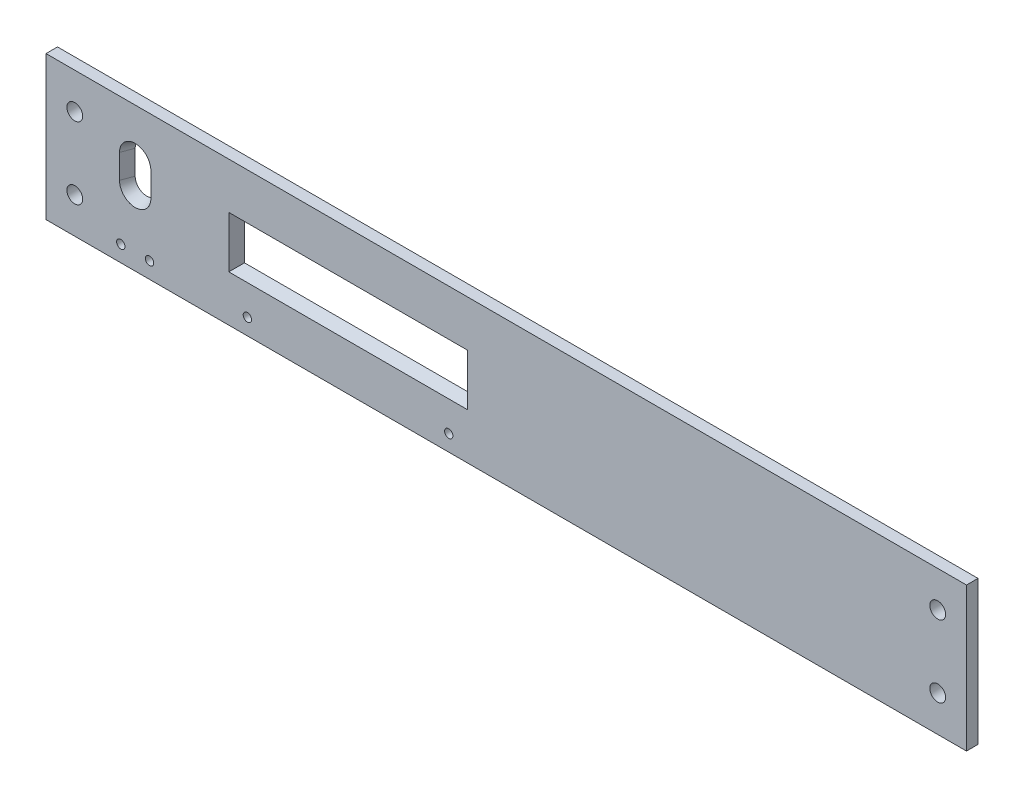
ISO-10303-21;
HEADER;
FILE_DESCRIPTION(('STEP AP214'),'2;1');
FILE_NAME('part.step','',(''),(''),'','','');
FILE_SCHEMA(('AUTOMOTIVE_DESIGN { 1 0 10303 214 1 1 1 1 }'));
ENDSEC;
DATA;
#1=APPLICATION_CONTEXT('core data for automotive mechanical design processes');
#2=APPLICATION_PROTOCOL_DEFINITION('international standard','automotive_design',2000,#1);
#3=PRODUCT_CONTEXT('',#1,'mechanical');
#4=PRODUCT('Part','Part','',(#3));
#5=PRODUCT_RELATED_PRODUCT_CATEGORY('part','',(#4));
#6=PRODUCT_DEFINITION_FORMATION('','',#4);
#7=PRODUCT_DEFINITION_CONTEXT('part definition',#1,'design');
#8=PRODUCT_DEFINITION('design','',#6,#7);
#9=PRODUCT_DEFINITION_SHAPE('','',#8);
#10=(LENGTH_UNIT() NAMED_UNIT(*) SI_UNIT(.MILLI.,.METRE.));
#11=(NAMED_UNIT(*) PLANE_ANGLE_UNIT() SI_UNIT($,.RADIAN.));
#12=(NAMED_UNIT(*) SI_UNIT($,.STERADIAN.) SOLID_ANGLE_UNIT());
#13=UNCERTAINTY_MEASURE_WITH_UNIT(LENGTH_MEASURE(1.E-05),#10,'distance_accuracy_value','');
#14=(GEOMETRIC_REPRESENTATION_CONTEXT(3) GLOBAL_UNCERTAINTY_ASSIGNED_CONTEXT((#13)) GLOBAL_UNIT_ASSIGNED_CONTEXT((#10,
#11,#12)) REPRESENTATION_CONTEXT('',''));
#15=CARTESIAN_POINT('',(0.,0.,0.));
#16=DIRECTION('',(0.,0.,1.));
#17=DIRECTION('',(1.,0.,0.));
#18=AXIS2_PLACEMENT_3D('',#15,#16,#17);
#19=CARTESIAN_POINT('',(0.,0.,4.));
#20=DIRECTION('',(1.,0.,0.));
#21=DIRECTION('',(0.,0.,-1.));
#22=AXIS2_PLACEMENT_3D('',#19,#20,#21);
#23=PLANE('',#22);
#24=DIRECTION('',(0.,-1.,0.));
#25=VECTOR('',#24,1.);
#26=CARTESIAN_POINT('',(0.,0.,0.));
#27=LINE('',#26,#25);
#28=CARTESIAN_POINT('',(0.,50.,0.));
#29=VERTEX_POINT('',#28);
#30=CARTESIAN_POINT('',(0.,0.,0.));
#31=VERTEX_POINT('',#30);
#32=EDGE_CURVE('E256',#29,#31,#27,.T.);
#33=ORIENTED_EDGE('',*,*,#32,.T.);
#34=DIRECTION('',(0.,0.,-1.));
#35=VECTOR('',#34,1.);
#36=CARTESIAN_POINT('',(0.,0.,4.));
#37=LINE('',#36,#35);
#38=CARTESIAN_POINT('',(0.,0.,4.));
#39=VERTEX_POINT('',#38);
#40=EDGE_CURVE('E11',#39,#31,#37,.T.);
#41=ORIENTED_EDGE('',*,*,#40,.F.);
#42=DIRECTION('',(0.,-1.,0.));
#43=VECTOR('',#42,1.);
#44=CARTESIAN_POINT('',(0.,0.,4.));
#45=LINE('',#44,#43);
#46=CARTESIAN_POINT('',(0.,50.,4.));
#47=VERTEX_POINT('',#46);
#48=EDGE_CURVE('E257',#47,#39,#45,.T.);
#49=ORIENTED_EDGE('',*,*,#48,.F.);
#50=DIRECTION('',(0.,0.,-1.));
#51=VECTOR('',#50,1.);
#52=CARTESIAN_POINT('',(0.,50.,4.));
#53=LINE('',#52,#51);
#54=EDGE_CURVE('E267',#47,#29,#53,.T.);
#55=ORIENTED_EDGE('',*,*,#54,.T.);
#56=EDGE_LOOP('',(#33,#41,#49,#55));
#57=FACE_BOUND('',#56,.T.);
#58=ADVANCED_FACE('F41',(#57),#23,.F.);
#59=CARTESIAN_POINT('',(0.,0.,4.));
#60=DIRECTION('',(0.,1.,0.));
#61=DIRECTION('',(0.,0.,1.));
#62=AXIS2_PLACEMENT_3D('',#59,#60,#61);
#63=PLANE('',#62);
#64=DIRECTION('',(1.,0.,0.));
#65=VECTOR('',#64,1.);
#66=CARTESIAN_POINT('',(0.,0.,0.));
#67=LINE('',#66,#65);
#68=CARTESIAN_POINT('',(320.,0.,0.));
#69=VERTEX_POINT('',#68);
#70=EDGE_CURVE('E270',#31,#69,#67,.T.);
#71=ORIENTED_EDGE('',*,*,#70,.T.);
#72=DIRECTION('',(0.,0.,-1.));
#73=VECTOR('',#72,1.);
#74=CARTESIAN_POINT('',(320.,0.,4.));
#75=LINE('',#74,#73);
#76=CARTESIAN_POINT('',(320.,0.,4.));
#77=VERTEX_POINT('',#76);
#78=EDGE_CURVE('E51',#77,#69,#75,.T.);
#79=ORIENTED_EDGE('',*,*,#78,.F.);
#80=DIRECTION('',(1.,0.,0.));
#81=VECTOR('',#80,1.);
#82=CARTESIAN_POINT('',(0.,0.,4.));
#83=LINE('',#82,#81);
#84=EDGE_CURVE('E260',#39,#77,#83,.T.);
#85=ORIENTED_EDGE('',*,*,#84,.F.);
#86=ORIENTED_EDGE('',*,*,#40,.T.);
#87=EDGE_LOOP('',(#71,#79,#85,#86));
#88=FACE_BOUND('',#87,.T.);
#89=ADVANCED_FACE('F299',(#88),#63,.F.);
#90=CARTESIAN_POINT('',(320.,0.,4.));
#91=DIRECTION('',(-1.,0.,0.));
#92=DIRECTION('',(0.,0.,1.));
#93=AXIS2_PLACEMENT_3D('',#90,#91,#92);
#94=PLANE('',#93);
#95=DIRECTION('',(0.,1.,0.));
#96=VECTOR('',#95,1.);
#97=CARTESIAN_POINT('',(320.,0.,0.));
#98=LINE('',#97,#96);
#99=CARTESIAN_POINT('',(320.,50.,0.));
#100=VERTEX_POINT('',#99);
#101=EDGE_CURVE('E272',#69,#100,#98,.T.);
#102=ORIENTED_EDGE('',*,*,#101,.T.);
#103=DIRECTION('',(0.,0.,-1.));
#104=VECTOR('',#103,1.);
#105=CARTESIAN_POINT('',(320.,50.,4.));
#106=LINE('',#105,#104);
#107=CARTESIAN_POINT('',(320.,50.,4.));
#108=VERTEX_POINT('',#107);
#109=EDGE_CURVE('E277',#108,#100,#106,.T.);
#110=ORIENTED_EDGE('',*,*,#109,.F.);
#111=DIRECTION('',(0.,1.,0.));
#112=VECTOR('',#111,1.);
#113=CARTESIAN_POINT('',(320.,0.,4.));
#114=LINE('',#113,#112);
#115=EDGE_CURVE('E263',#77,#108,#114,.T.);
#116=ORIENTED_EDGE('',*,*,#115,.F.);
#117=ORIENTED_EDGE('',*,*,#78,.T.);
#118=EDGE_LOOP('',(#102,#110,#116,#117));
#119=FACE_BOUND('',#118,.T.);
#120=ADVANCED_FACE('F285',(#119),#94,.F.);
#121=CARTESIAN_POINT('',(0.,50.,4.));
#122=DIRECTION('',(0.,-1.,0.));
#123=DIRECTION('',(0.,0.,-1.));
#124=AXIS2_PLACEMENT_3D('',#121,#122,#123);
#125=PLANE('',#124);
#126=DIRECTION('',(-1.,0.,0.));
#127=VECTOR('',#126,1.);
#128=CARTESIAN_POINT('',(0.,50.,0.));
#129=LINE('',#128,#127);
#130=EDGE_CURVE('E261',#100,#29,#129,.T.);
#131=ORIENTED_EDGE('',*,*,#130,.T.);
#132=ORIENTED_EDGE('',*,*,#54,.F.);
#133=DIRECTION('',(-1.,0.,0.));
#134=VECTOR('',#133,1.);
#135=CARTESIAN_POINT('',(0.,50.,4.));
#136=LINE('',#135,#134);
#137=EDGE_CURVE('E265',#108,#47,#136,.T.);
#138=ORIENTED_EDGE('',*,*,#137,.F.);
#139=ORIENTED_EDGE('',*,*,#109,.T.);
#140=EDGE_LOOP('',(#131,#132,#138,#139));
#141=FACE_BOUND('',#140,.T.);
#142=ADVANCED_FACE('F293',(#141),#125,.F.);
#143=CARTESIAN_POINT('',(0.,0.,4.));
#144=DIRECTION('',(0.,0.,-1.));
#145=DIRECTION('',(-1.,0.,0.));
#146=AXIS2_PLACEMENT_3D('',#143,#144,#145);
#147=PLANE('',#146);
#148=CARTESIAN_POINT('',(26.,5.6,4.));
#149=DIRECTION('',(0.,0.,1.));
#150=DIRECTION('',(1.,0.,0.));
#151=AXIS2_PLACEMENT_3D('',#148,#149,#150);
#152=CIRCLE('',#151,1.45);
#153=CARTESIAN_POINT('',(27.45,5.6,4.));
#154=VERTEX_POINT('',#153);
#155=EDGE_CURVE('E531',#154,#154,#152,.T.);
#156=ORIENTED_EDGE('',*,*,#155,.F.);
#157=EDGE_LOOP('',(#156));
#158=FACE_BOUND('',#157,.T.);
#159=CARTESIAN_POINT('',(36.,5.6,4.));
#160=DIRECTION('',(0.,0.,1.));
#161=DIRECTION('',(1.,0.,0.));
#162=AXIS2_PLACEMENT_3D('',#159,#160,#161);
#163=CIRCLE('',#162,1.45);
#164=CARTESIAN_POINT('',(37.45,5.6,4.));
#165=VERTEX_POINT('',#164);
#166=EDGE_CURVE('E146',#165,#165,#163,.T.);
#167=ORIENTED_EDGE('',*,*,#166,.F.);
#168=EDGE_LOOP('',(#167));
#169=FACE_BOUND('',#168,.T.);
#170=CARTESIAN_POINT('',(70.,5.6,4.));
#171=DIRECTION('',(0.,0.,1.));
#172=DIRECTION('',(1.,0.,0.));
#173=AXIS2_PLACEMENT_3D('',#170,#171,#172);
#174=CIRCLE('',#173,1.44999999999999);
#175=CARTESIAN_POINT('',(71.45,5.6,4.));
#176=VERTEX_POINT('',#175);
#177=EDGE_CURVE('E142',#176,#176,#174,.T.);
#178=ORIENTED_EDGE('',*,*,#177,.F.);
#179=EDGE_LOOP('',(#178));
#180=FACE_BOUND('',#179,.T.);
#181=CARTESIAN_POINT('',(140.,5.59999999999998,4.));
#182=DIRECTION('',(0.,0.,1.));
#183=DIRECTION('',(1.,0.,0.));
#184=AXIS2_PLACEMENT_3D('',#181,#182,#183);
#185=CIRCLE('',#184,1.45000000000001);
#186=CARTESIAN_POINT('',(141.45,5.59999999999998,4.));
#187=VERTEX_POINT('',#186);
#188=EDGE_CURVE('E130',#187,#187,#185,.T.);
#189=ORIENTED_EDGE('',*,*,#188,.F.);
#190=EDGE_LOOP('',(#189));
#191=FACE_BOUND('',#190,.T.);
#192=DIRECTION('',(0.,-1.,0.));
#193=VECTOR('',#192,1.);
#194=CARTESIAN_POINT('',(36.4558809370648,24.6,4.));
#195=LINE('',#194,#193);
#196=CARTESIAN_POINT('',(36.4558809370648,24.6,4.));
#197=VERTEX_POINT('',#196);
#198=CARTESIAN_POINT('',(36.4558809370648,33.,4.));
#199=VERTEX_POINT('',#198);
#200=EDGE_CURVE('E96',#197,#199,#195,.F.);
#201=ORIENTED_EDGE('',*,*,#200,.F.);
#202=CARTESIAN_POINT('',(31.,24.6,4.));
#203=DIRECTION('',(0.,0.,-1.));
#204=DIRECTION('',(-1.,0.,0.));
#205=AXIS2_PLACEMENT_3D('',#202,#203,#204);
#206=CIRCLE('',#205,5.45588093706481);
#207=CARTESIAN_POINT('',(25.5441190629352,24.6,4.));
#208=VERTEX_POINT('',#207);
#209=EDGE_CURVE('E60',#208,#197,#206,.F.);
#210=ORIENTED_EDGE('',*,*,#209,.F.);
#211=DIRECTION('',(0.,1.,0.));
#212=VECTOR('',#211,1.);
#213=CARTESIAN_POINT('',(25.5441190629352,24.6,4.));
#214=LINE('',#213,#212);
#215=CARTESIAN_POINT('',(25.5441190629352,33.,4.));
#216=VERTEX_POINT('',#215);
#217=EDGE_CURVE('E102',#216,#208,#214,.F.);
#218=ORIENTED_EDGE('',*,*,#217,.F.);
#219=CARTESIAN_POINT('',(31.,33.,4.));
#220=DIRECTION('',(0.,0.,-1.));
#221=DIRECTION('',(-1.,0.,0.));
#222=AXIS2_PLACEMENT_3D('',#219,#220,#221);
#223=CIRCLE('',#222,5.45588093706481);
#224=EDGE_CURVE('E86',#199,#216,#223,.F.);
#225=ORIENTED_EDGE('',*,*,#224,.F.);
#226=EDGE_LOOP('',(#201,#210,#218,#225));
#227=FACE_BOUND('',#226,.T.);
#228=DIRECTION('',(-1.,0.,0.));
#229=VECTOR('',#228,1.);
#230=CARTESIAN_POINT('',(65.,16.0441190629352,4.));
#231=LINE('',#230,#229);
#232=CARTESIAN_POINT('',(63.5441190629352,16.0441190629352,4.));
#233=VERTEX_POINT('',#232);
#234=CARTESIAN_POINT('',(146.455880937065,16.0441190629352,4.));
#235=VERTEX_POINT('',#234);
#236=EDGE_CURVE('E113',#233,#235,#231,.F.);
#237=ORIENTED_EDGE('',*,*,#236,.F.);
#238=DIRECTION('',(0.,1.,0.));
#239=VECTOR('',#238,1.);
#240=CARTESIAN_POINT('',(63.5441190629352,32.5,4.));
#241=LINE('',#240,#239);
#242=CARTESIAN_POINT('',(63.5441190629352,33.9558809370648,4.));
#243=VERTEX_POINT('',#242);
#244=EDGE_CURVE('E109',#243,#233,#241,.F.);
#245=ORIENTED_EDGE('',*,*,#244,.F.);
#246=DIRECTION('',(1.,0.,0.));
#247=VECTOR('',#246,1.);
#248=CARTESIAN_POINT('',(65.,33.9558809370648,4.));
#249=LINE('',#248,#247);
#250=CARTESIAN_POINT('',(146.455880937065,33.9558809370648,4.));
#251=VERTEX_POINT('',#250);
#252=EDGE_CURVE('E125',#251,#243,#249,.F.);
#253=ORIENTED_EDGE('',*,*,#252,.F.);
#254=DIRECTION('',(0.,-1.,0.));
#255=VECTOR('',#254,1.);
#256=CARTESIAN_POINT('',(146.455880937065,32.5,4.));
#257=LINE('',#256,#255);
#258=EDGE_CURVE('E121',#235,#251,#257,.F.);
#259=ORIENTED_EDGE('',*,*,#258,.F.);
#260=EDGE_LOOP('',(#237,#245,#253,#259));
#261=FACE_BOUND('',#260,.T.);
#262=CARTESIAN_POINT('',(310.,12.5,4.));
#263=DIRECTION('',(0.,0.,1.));
#264=DIRECTION('',(1.,0.,0.));
#265=AXIS2_PLACEMENT_3D('',#262,#263,#264);
#266=CIRCLE('',#265,2.74999999999997);
#267=CARTESIAN_POINT('',(312.75,12.5,4.));
#268=VERTEX_POINT('',#267);
#269=EDGE_CURVE('E238',#268,#268,#266,.T.);
#270=ORIENTED_EDGE('',*,*,#269,.F.);
#271=EDGE_LOOP('',(#270));
#272=FACE_BOUND('',#271,.T.);
#273=CARTESIAN_POINT('',(10.,12.5,4.));
#274=DIRECTION('',(0.,0.,1.));
#275=DIRECTION('',(1.,0.,0.));
#276=AXIS2_PLACEMENT_3D('',#273,#274,#275);
#277=CIRCLE('',#276,2.75);
#278=CARTESIAN_POINT('',(12.75,12.5,4.));
#279=VERTEX_POINT('',#278);
#280=EDGE_CURVE('E244',#279,#279,#277,.T.);
#281=ORIENTED_EDGE('',*,*,#280,.F.);
#282=EDGE_LOOP('',(#281));
#283=FACE_BOUND('',#282,.T.);
#284=CARTESIAN_POINT('',(10.,37.5,4.));
#285=DIRECTION('',(0.,0.,1.));
#286=DIRECTION('',(1.,0.,0.));
#287=AXIS2_PLACEMENT_3D('',#284,#285,#286);
#288=CIRCLE('',#287,2.75);
#289=CARTESIAN_POINT('',(12.75,37.5,4.));
#290=VERTEX_POINT('',#289);
#291=EDGE_CURVE('E247',#290,#290,#288,.T.);
#292=ORIENTED_EDGE('',*,*,#291,.F.);
#293=EDGE_LOOP('',(#292));
#294=FACE_BOUND('',#293,.T.);
#295=CARTESIAN_POINT('',(310.,37.5,4.));
#296=DIRECTION('',(0.,0.,1.));
#297=DIRECTION('',(1.,0.,0.));
#298=AXIS2_PLACEMENT_3D('',#295,#296,#297);
#299=CIRCLE('',#298,2.74999999999997);
#300=CARTESIAN_POINT('',(312.75,37.5,4.));
#301=VERTEX_POINT('',#300);
#302=EDGE_CURVE('E250',#301,#301,#299,.T.);
#303=ORIENTED_EDGE('',*,*,#302,.F.);
#304=EDGE_LOOP('',(#303));
#305=FACE_BOUND('',#304,.T.);
#306=ORIENTED_EDGE('',*,*,#48,.T.);
#307=ORIENTED_EDGE('',*,*,#84,.T.);
#308=ORIENTED_EDGE('',*,*,#115,.T.);
#309=ORIENTED_EDGE('',*,*,#137,.T.);
#310=EDGE_LOOP('',(#306,#307,#308,#309));
#311=FACE_BOUND('',#310,.T.);
#312=ADVANCED_FACE('F100',(#158,#169,#180,#191,#227,#261,#272,#283,#294,#305,#311),#147,.F.);
#313=CARTESIAN_POINT('',(0.,0.,0.));
#314=DIRECTION('',(0.,0.,-1.));
#315=DIRECTION('',(-1.,0.,0.));
#316=AXIS2_PLACEMENT_3D('',#313,#314,#315);
#317=PLANE('',#316);
#318=CARTESIAN_POINT('',(26.,5.6,0.));
#319=DIRECTION('',(0.,0.,-1.));
#320=DIRECTION('',(-1.,0.,0.));
#321=AXIS2_PLACEMENT_3D('',#318,#319,#320);
#322=CIRCLE('',#321,1.45);
#323=CARTESIAN_POINT('',(24.55,5.6,0.));
#324=VERTEX_POINT('',#323);
#325=EDGE_CURVE('E518',#324,#324,#322,.T.);
#326=ORIENTED_EDGE('',*,*,#325,.F.);
#327=EDGE_LOOP('',(#326));
#328=FACE_BOUND('',#327,.T.);
#329=CARTESIAN_POINT('',(36.,5.6,0.));
#330=DIRECTION('',(0.,0.,-1.));
#331=DIRECTION('',(-1.,0.,0.));
#332=AXIS2_PLACEMENT_3D('',#329,#330,#331);
#333=CIRCLE('',#332,1.45);
#334=CARTESIAN_POINT('',(34.55,5.6,0.));
#335=VERTEX_POINT('',#334);
#336=EDGE_CURVE('E143',#335,#335,#333,.T.);
#337=ORIENTED_EDGE('',*,*,#336,.F.);
#338=EDGE_LOOP('',(#337));
#339=FACE_BOUND('',#338,.T.);
#340=CARTESIAN_POINT('',(70.,5.6,0.));
#341=DIRECTION('',(0.,0.,-1.));
#342=DIRECTION('',(-1.,0.,0.));
#343=AXIS2_PLACEMENT_3D('',#340,#341,#342);
#344=CIRCLE('',#343,1.44999999999999);
#345=CARTESIAN_POINT('',(68.55,5.6,0.));
#346=VERTEX_POINT('',#345);
#347=EDGE_CURVE('E135',#346,#346,#344,.T.);
#348=ORIENTED_EDGE('',*,*,#347,.F.);
#349=EDGE_LOOP('',(#348));
#350=FACE_BOUND('',#349,.T.);
#351=CARTESIAN_POINT('',(140.,5.59999999999998,0.));
#352=DIRECTION('',(0.,0.,-1.));
#353=DIRECTION('',(-1.,0.,0.));
#354=AXIS2_PLACEMENT_3D('',#351,#352,#353);
#355=CIRCLE('',#354,1.45000000000001);
#356=CARTESIAN_POINT('',(138.55,5.59999999999998,0.));
#357=VERTEX_POINT('',#356);
#358=EDGE_CURVE('E128',#357,#357,#355,.T.);
#359=ORIENTED_EDGE('',*,*,#358,.F.);
#360=EDGE_LOOP('',(#359));
#361=FACE_BOUND('',#360,.T.);
#362=CARTESIAN_POINT('',(31.,24.6,0.));
#363=DIRECTION('',(0.,0.,1.));
#364=DIRECTION('',(1.,0.,0.));
#365=AXIS2_PLACEMENT_3D('',#362,#363,#364);
#366=CIRCLE('',#365,4.);
#367=CARTESIAN_POINT('',(27.,24.6,0.));
#368=VERTEX_POINT('',#367);
#369=CARTESIAN_POINT('',(35.,24.6,0.));
#370=VERTEX_POINT('',#369);
#371=EDGE_CURVE('E104',#368,#370,#366,.T.);
#372=ORIENTED_EDGE('',*,*,#371,.T.);
#373=DIRECTION('',(0.,1.,0.));
#374=VECTOR('',#373,1.);
#375=CARTESIAN_POINT('',(35.,24.6,0.));
#376=LINE('',#375,#374);
#377=CARTESIAN_POINT('',(35.,33.,0.));
#378=VERTEX_POINT('',#377);
#379=EDGE_CURVE('E216',#370,#378,#376,.T.);
#380=ORIENTED_EDGE('',*,*,#379,.T.);
#381=CARTESIAN_POINT('',(31.,33.,0.));
#382=DIRECTION('',(0.,0.,1.));
#383=DIRECTION('',(1.,0.,0.));
#384=AXIS2_PLACEMENT_3D('',#381,#382,#383);
#385=CIRCLE('',#384,4.);
#386=CARTESIAN_POINT('',(27.,33.,0.));
#387=VERTEX_POINT('',#386);
#388=EDGE_CURVE('E89',#378,#387,#385,.T.);
#389=ORIENTED_EDGE('',*,*,#388,.T.);
#390=DIRECTION('',(0.,-1.,0.));
#391=VECTOR('',#390,1.);
#392=CARTESIAN_POINT('',(27.,24.6,0.));
#393=LINE('',#392,#391);
#394=EDGE_CURVE('E108',#387,#368,#393,.T.);
#395=ORIENTED_EDGE('',*,*,#394,.T.);
#396=EDGE_LOOP('',(#372,#380,#389,#395));
#397=FACE_BOUND('',#396,.T.);
#398=DIRECTION('',(0.,-1.,0.));
#399=VECTOR('',#398,1.);
#400=CARTESIAN_POINT('',(65.,32.5,0.));
#401=LINE('',#400,#399);
#402=CARTESIAN_POINT('',(65.,32.5,0.));
#403=VERTEX_POINT('',#402);
#404=CARTESIAN_POINT('',(65.,17.5,0.));
#405=VERTEX_POINT('',#404);
#406=EDGE_CURVE('E127',#403,#405,#401,.T.);
#407=ORIENTED_EDGE('',*,*,#406,.T.);
#408=DIRECTION('',(1.,0.,0.));
#409=VECTOR('',#408,1.);
#410=CARTESIAN_POINT('',(65.,17.5,0.));
#411=LINE('',#410,#409);
#412=CARTESIAN_POINT('',(145.,17.5,0.));
#413=VERTEX_POINT('',#412);
#414=EDGE_CURVE('E228',#405,#413,#411,.T.);
#415=ORIENTED_EDGE('',*,*,#414,.T.);
#416=DIRECTION('',(0.,1.,0.));
#417=VECTOR('',#416,1.);
#418=CARTESIAN_POINT('',(145.,32.5,0.));
#419=LINE('',#418,#417);
#420=CARTESIAN_POINT('',(145.,32.5,0.));
#421=VERTEX_POINT('',#420);
#422=EDGE_CURVE('E231',#413,#421,#419,.T.);
#423=ORIENTED_EDGE('',*,*,#422,.T.);
#424=DIRECTION('',(-1.,0.,0.));
#425=VECTOR('',#424,1.);
#426=CARTESIAN_POINT('',(65.,32.5,0.));
#427=LINE('',#426,#425);
#428=EDGE_CURVE('E157',#421,#403,#427,.T.);
#429=ORIENTED_EDGE('',*,*,#428,.T.);
#430=EDGE_LOOP('',(#407,#415,#423,#429));
#431=FACE_BOUND('',#430,.T.);
#432=CARTESIAN_POINT('',(310.,12.5,0.));
#433=DIRECTION('',(0.,0.,-1.));
#434=DIRECTION('',(-1.,0.,0.));
#435=AXIS2_PLACEMENT_3D('',#432,#433,#434);
#436=CIRCLE('',#435,2.74999999999997);
#437=CARTESIAN_POINT('',(307.25,12.5,0.));
#438=VERTEX_POINT('',#437);
#439=EDGE_CURVE('E156',#438,#438,#436,.T.);
#440=ORIENTED_EDGE('',*,*,#439,.F.);
#441=EDGE_LOOP('',(#440));
#442=FACE_BOUND('',#441,.T.);
#443=CARTESIAN_POINT('',(10.,12.5,0.));
#444=DIRECTION('',(0.,0.,-1.));
#445=DIRECTION('',(-1.,0.,0.));
#446=AXIS2_PLACEMENT_3D('',#443,#444,#445);
#447=CIRCLE('',#446,2.75);
#448=CARTESIAN_POINT('',(7.25,12.5,0.));
#449=VERTEX_POINT('',#448);
#450=EDGE_CURVE('E241',#449,#449,#447,.T.);
#451=ORIENTED_EDGE('',*,*,#450,.F.);
#452=EDGE_LOOP('',(#451));
#453=FACE_BOUND('',#452,.T.);
#454=CARTESIAN_POINT('',(10.,37.5,0.));
#455=DIRECTION('',(0.,0.,-1.));
#456=DIRECTION('',(-1.,0.,0.));
#457=AXIS2_PLACEMENT_3D('',#454,#455,#456);
#458=CIRCLE('',#457,2.75);
#459=CARTESIAN_POINT('',(7.25,37.5,0.));
#460=VERTEX_POINT('',#459);
#461=EDGE_CURVE('E139',#460,#460,#458,.T.);
#462=ORIENTED_EDGE('',*,*,#461,.F.);
#463=EDGE_LOOP('',(#462));
#464=FACE_BOUND('',#463,.T.);
#465=CARTESIAN_POINT('',(310.,37.5,0.));
#466=DIRECTION('',(0.,0.,-1.));
#467=DIRECTION('',(-1.,0.,0.));
#468=AXIS2_PLACEMENT_3D('',#465,#466,#467);
#469=CIRCLE('',#468,2.74999999999997);
#470=CARTESIAN_POINT('',(307.25,37.5,0.));
#471=VERTEX_POINT('',#470);
#472=EDGE_CURVE('E253',#471,#471,#469,.T.);
#473=ORIENTED_EDGE('',*,*,#472,.F.);
#474=EDGE_LOOP('',(#473));
#475=FACE_BOUND('',#474,.T.);
#476=ORIENTED_EDGE('',*,*,#32,.F.);
#477=ORIENTED_EDGE('',*,*,#130,.F.);
#478=ORIENTED_EDGE('',*,*,#101,.F.);
#479=ORIENTED_EDGE('',*,*,#70,.F.);
#480=EDGE_LOOP('',(#476,#477,#478,#479));
#481=FACE_BOUND('',#480,.T.);
#482=ADVANCED_FACE('F219',(#328,#339,#350,#361,#397,#431,#442,#453,#464,#475,#481),#317,.T.);
#483=CARTESIAN_POINT('',(310.,37.5,4.));
#484=DIRECTION('',(0.,0.,1.));
#485=DIRECTION('',(1.,0.,0.));
#486=AXIS2_PLACEMENT_3D('',#483,#484,#485);
#487=CYLINDRICAL_SURFACE('',#486,2.74999999999997);
#488=ORIENTED_EDGE('',*,*,#472,.T.);
#489=EDGE_LOOP('',(#488));
#490=FACE_BOUND('',#489,.T.);
#491=ORIENTED_EDGE('',*,*,#302,.T.);
#492=EDGE_LOOP('',(#491));
#493=FACE_BOUND('',#492,.T.);
#494=ADVANCED_FACE('F405',(#490,#493),#487,.F.);
#495=CARTESIAN_POINT('',(10.,37.5,4.));
#496=DIRECTION('',(0.,0.,1.));
#497=DIRECTION('',(1.,0.,0.));
#498=AXIS2_PLACEMENT_3D('',#495,#496,#497);
#499=CYLINDRICAL_SURFACE('',#498,2.75);
#500=ORIENTED_EDGE('',*,*,#461,.T.);
#501=EDGE_LOOP('',(#500));
#502=FACE_BOUND('',#501,.T.);
#503=ORIENTED_EDGE('',*,*,#291,.T.);
#504=EDGE_LOOP('',(#503));
#505=FACE_BOUND('',#504,.T.);
#506=ADVANCED_FACE('F423',(#502,#505),#499,.F.);
#507=CARTESIAN_POINT('',(10.,12.5,4.));
#508=DIRECTION('',(0.,0.,1.));
#509=DIRECTION('',(1.,0.,0.));
#510=AXIS2_PLACEMENT_3D('',#507,#508,#509);
#511=CYLINDRICAL_SURFACE('',#510,2.75);
#512=ORIENTED_EDGE('',*,*,#450,.T.);
#513=EDGE_LOOP('',(#512));
#514=FACE_BOUND('',#513,.T.);
#515=ORIENTED_EDGE('',*,*,#280,.T.);
#516=EDGE_LOOP('',(#515));
#517=FACE_BOUND('',#516,.T.);
#518=ADVANCED_FACE('F414',(#514,#517),#511,.F.);
#519=CARTESIAN_POINT('',(310.,12.5,4.));
#520=DIRECTION('',(0.,0.,1.));
#521=DIRECTION('',(1.,0.,0.));
#522=AXIS2_PLACEMENT_3D('',#519,#520,#521);
#523=CYLINDRICAL_SURFACE('',#522,2.74999999999997);
#524=ORIENTED_EDGE('',*,*,#439,.T.);
#525=EDGE_LOOP('',(#524));
#526=FACE_BOUND('',#525,.T.);
#527=ORIENTED_EDGE('',*,*,#269,.T.);
#528=EDGE_LOOP('',(#527));
#529=FACE_BOUND('',#528,.T.);
#530=ADVANCED_FACE('F318',(#526,#529),#523,.F.);
#531=CARTESIAN_POINT('',(65.,32.5,0.));
#532=DIRECTION('',(0.939692620785908,0.,0.342020143325669));
#533=DIRECTION('',(0.342020143325669,0.,-0.939692620785908));
#534=AXIS2_PLACEMENT_3D('',#531,#532,#533);
#535=PLANE('',#534);
#536=ORIENTED_EDGE('',*,*,#244,.T.);
#537=DIRECTION('',(-0.323615577118185,-0.323615577118185,0.889126490715988));
#538=VECTOR('',#537,1.);
#539=CARTESIAN_POINT('',(66.570905626303,19.070905626303,-4.31602773636182));
#540=LINE('',#539,#538);
#541=EDGE_CURVE('E154',#405,#233,#540,.T.);
#542=ORIENTED_EDGE('',*,*,#541,.F.);
#543=ORIENTED_EDGE('',*,*,#406,.F.);
#544=DIRECTION('',(-0.323615577118185,0.323615577118185,0.889126490715988));
#545=VECTOR('',#544,1.);
#546=CARTESIAN_POINT('',(65.,32.5,0.));
#547=LINE('',#546,#545);
#548=EDGE_CURVE('E150',#403,#243,#547,.T.);
#549=ORIENTED_EDGE('',*,*,#548,.T.);
#550=EDGE_LOOP('',(#536,#542,#543,#549));
#551=FACE_BOUND('',#550,.T.);
#552=ADVANCED_FACE('F315',(#551),#535,.T.);
#553=CARTESIAN_POINT('',(65.,32.5,0.));
#554=DIRECTION('',(0.,-0.939692620785908,0.342020143325669));
#555=DIRECTION('',(0.,-0.342020143325669,-0.939692620785908));
#556=AXIS2_PLACEMENT_3D('',#553,#554,#555);
#557=PLANE('',#556);
#558=ORIENTED_EDGE('',*,*,#252,.T.);
#559=ORIENTED_EDGE('',*,*,#548,.F.);
#560=ORIENTED_EDGE('',*,*,#428,.F.);
#561=DIRECTION('',(0.323615577118185,0.323615577118185,0.889126490715988));
#562=VECTOR('',#561,1.);
#563=CARTESIAN_POINT('',(145.,32.5,0.));
#564=LINE('',#563,#562);
#565=EDGE_CURVE('E147',#421,#251,#564,.T.);
#566=ORIENTED_EDGE('',*,*,#565,.T.);
#567=EDGE_LOOP('',(#558,#559,#560,#566));
#568=FACE_BOUND('',#567,.T.);
#569=ADVANCED_FACE('F174',(#568),#557,.T.);
#570=CARTESIAN_POINT('',(145.,32.5,0.));
#571=DIRECTION('',(-0.939692620785908,0.,0.342020143325669));
#572=DIRECTION('',(0.342020143325669,0.,0.939692620785908));
#573=AXIS2_PLACEMENT_3D('',#570,#571,#572);
#574=PLANE('',#573);
#575=ORIENTED_EDGE('',*,*,#258,.T.);
#576=ORIENTED_EDGE('',*,*,#565,.F.);
#577=ORIENTED_EDGE('',*,*,#422,.F.);
#578=DIRECTION('',(0.323615577118185,-0.323615577118185,0.889126490715988));
#579=VECTOR('',#578,1.);
#580=CARTESIAN_POINT('',(136.621836659717,25.8781633402829,-23.0188145939297));
#581=LINE('',#580,#579);
#582=EDGE_CURVE('E151',#413,#235,#581,.T.);
#583=ORIENTED_EDGE('',*,*,#582,.T.);
#584=EDGE_LOOP('',(#575,#576,#577,#583));
#585=FACE_BOUND('',#584,.T.);
#586=ADVANCED_FACE('F163',(#585),#574,.T.);
#587=CARTESIAN_POINT('',(65.,17.5,0.));
#588=DIRECTION('',(0.,0.939692620785908,0.342020143325669));
#589=DIRECTION('',(0.,-0.342020143325669,0.939692620785908));
#590=AXIS2_PLACEMENT_3D('',#587,#588,#589);
#591=PLANE('',#590);
#592=ORIENTED_EDGE('',*,*,#236,.T.);
#593=ORIENTED_EDGE('',*,*,#582,.F.);
#594=ORIENTED_EDGE('',*,*,#414,.F.);
#595=ORIENTED_EDGE('',*,*,#541,.T.);
#596=EDGE_LOOP('',(#592,#593,#594,#595));
#597=FACE_BOUND('',#596,.T.);
#598=ADVANCED_FACE('F312',(#597),#591,.T.);
#599=CARTESIAN_POINT('',(31.,24.6,0.));
#600=DIRECTION('',(0.,0.,1.));
#601=DIRECTION('',(1.,0.,0.));
#602=AXIS2_PLACEMENT_3D('',#599,#600,#601);
#603=CONICAL_SURFACE('',#602,4.,0.349065850398867);
#604=ORIENTED_EDGE('',*,*,#209,.T.);
#605=DIRECTION('',(-0.342020143325669,0.,-0.939692620785908));
#606=VECTOR('',#605,1.);
#607=CARTESIAN_POINT('',(35.,24.6,0.));
#608=LINE('',#607,#606);
#609=EDGE_CURVE('E93',#370,#197,#608,.F.);
#610=ORIENTED_EDGE('',*,*,#609,.F.);
#611=ORIENTED_EDGE('',*,*,#371,.F.);
#612=DIRECTION('',(0.342020143325669,0.,-0.939692620785908));
#613=VECTOR('',#612,1.);
#614=CARTESIAN_POINT('',(27.,24.6,0.));
#615=LINE('',#614,#613);
#616=EDGE_CURVE('E45',#368,#208,#615,.F.);
#617=ORIENTED_EDGE('',*,*,#616,.T.);
#618=EDGE_LOOP('',(#604,#610,#611,#617));
#619=FACE_BOUND('',#618,.T.);
#620=ADVANCED_FACE('F43',(#619),#603,.F.);
#621=CARTESIAN_POINT('',(27.,24.6,0.));
#622=DIRECTION('',(0.939692620785908,0.,0.342020143325669));
#623=DIRECTION('',(0.342020143325669,0.,-0.939692620785908));
#624=AXIS2_PLACEMENT_3D('',#621,#622,#623);
#625=PLANE('',#624);
#626=ORIENTED_EDGE('',*,*,#217,.T.);
#627=ORIENTED_EDGE('',*,*,#616,.F.);
#628=ORIENTED_EDGE('',*,*,#394,.F.);
#629=DIRECTION('',(0.342020143325669,0.,-0.939692620785908));
#630=VECTOR('',#629,1.);
#631=CARTESIAN_POINT('',(27.,33.,0.));
#632=LINE('',#631,#630);
#633=EDGE_CURVE('E77',#387,#216,#632,.F.);
#634=ORIENTED_EDGE('',*,*,#633,.T.);
#635=EDGE_LOOP('',(#626,#627,#628,#634));
#636=FACE_BOUND('',#635,.T.);
#637=ADVANCED_FACE('F326',(#636),#625,.T.);
#638=CARTESIAN_POINT('',(31.,33.,0.));
#639=DIRECTION('',(0.,0.,1.));
#640=DIRECTION('',(1.,0.,0.));
#641=AXIS2_PLACEMENT_3D('',#638,#639,#640);
#642=CONICAL_SURFACE('',#641,4.,0.349065850398867);
#643=ORIENTED_EDGE('',*,*,#224,.T.);
#644=ORIENTED_EDGE('',*,*,#633,.F.);
#645=ORIENTED_EDGE('',*,*,#388,.F.);
#646=DIRECTION('',(-0.342020143325669,0.,-0.939692620785908));
#647=VECTOR('',#646,1.);
#648=CARTESIAN_POINT('',(35.,33.,0.));
#649=LINE('',#648,#647);
#650=EDGE_CURVE('E82',#378,#199,#649,.F.);
#651=ORIENTED_EDGE('',*,*,#650,.T.);
#652=EDGE_LOOP('',(#643,#644,#645,#651));
#653=FACE_BOUND('',#652,.T.);
#654=ADVANCED_FACE('F84',(#653),#642,.F.);
#655=CARTESIAN_POINT('',(35.,24.6,0.));
#656=DIRECTION('',(-0.939692620785908,0.,0.342020143325669));
#657=DIRECTION('',(0.342020143325669,0.,0.939692620785908));
#658=AXIS2_PLACEMENT_3D('',#655,#656,#657);
#659=PLANE('',#658);
#660=ORIENTED_EDGE('',*,*,#200,.T.);
#661=ORIENTED_EDGE('',*,*,#650,.F.);
#662=ORIENTED_EDGE('',*,*,#379,.F.);
#663=ORIENTED_EDGE('',*,*,#609,.T.);
#664=EDGE_LOOP('',(#660,#661,#662,#663));
#665=FACE_BOUND('',#664,.T.);
#666=ADVANCED_FACE('F97',(#665),#659,.T.);
#667=CARTESIAN_POINT('',(140.,5.59999999999998,4.));
#668=DIRECTION('',(0.,0.,1.));
#669=DIRECTION('',(1.,0.,0.));
#670=AXIS2_PLACEMENT_3D('',#667,#668,#669);
#671=CYLINDRICAL_SURFACE('',#670,1.45000000000001);
#672=ORIENTED_EDGE('',*,*,#358,.T.);
#673=EDGE_LOOP('',(#672));
#674=FACE_BOUND('',#673,.T.);
#675=ORIENTED_EDGE('',*,*,#188,.T.);
#676=EDGE_LOOP('',(#675));
#677=FACE_BOUND('',#676,.T.);
#678=ADVANCED_FACE('F324',(#674,#677),#671,.F.);
#679=CARTESIAN_POINT('',(70.,5.6,4.));
#680=DIRECTION('',(0.,0.,1.));
#681=DIRECTION('',(1.,0.,0.));
#682=AXIS2_PLACEMENT_3D('',#679,#680,#681);
#683=CYLINDRICAL_SURFACE('',#682,1.44999999999999);
#684=ORIENTED_EDGE('',*,*,#347,.T.);
#685=EDGE_LOOP('',(#684));
#686=FACE_BOUND('',#685,.T.);
#687=ORIENTED_EDGE('',*,*,#177,.T.);
#688=EDGE_LOOP('',(#687));
#689=FACE_BOUND('',#688,.T.);
#690=ADVANCED_FACE('F381',(#686,#689),#683,.F.);
#691=CARTESIAN_POINT('',(36.,5.6,4.));
#692=DIRECTION('',(0.,0.,1.));
#693=DIRECTION('',(1.,0.,0.));
#694=AXIS2_PLACEMENT_3D('',#691,#692,#693);
#695=CYLINDRICAL_SURFACE('',#694,1.45);
#696=ORIENTED_EDGE('',*,*,#336,.T.);
#697=EDGE_LOOP('',(#696));
#698=FACE_BOUND('',#697,.T.);
#699=ORIENTED_EDGE('',*,*,#166,.T.);
#700=EDGE_LOOP('',(#699));
#701=FACE_BOUND('',#700,.T.);
#702=ADVANCED_FACE('F372',(#698,#701),#695,.F.);
#703=CARTESIAN_POINT('',(26.,5.6,4.));
#704=DIRECTION('',(0.,0.,1.));
#705=DIRECTION('',(1.,0.,0.));
#706=AXIS2_PLACEMENT_3D('',#703,#704,#705);
#707=CYLINDRICAL_SURFACE('',#706,1.45);
#708=ORIENTED_EDGE('',*,*,#325,.T.);
#709=EDGE_LOOP('',(#708));
#710=FACE_BOUND('',#709,.T.);
#711=ORIENTED_EDGE('',*,*,#155,.T.);
#712=EDGE_LOOP('',(#711));
#713=FACE_BOUND('',#712,.T.);
#714=ADVANCED_FACE('F368',(#710,#713),#707,.F.);
#715=CLOSED_SHELL('',(#58,#89,#120,#142,#312,#482,#494,#506,#518,#530,#552,#569,#586,#598,#620,
#637,#654,#666,#678,#690,#702,#714));
#716=MANIFOLD_SOLID_BREP('B2',#715);
#717=ADVANCED_BREP_SHAPE_REPRESENTATION('',(#18,#716),#14);
#718=SHAPE_DEFINITION_REPRESENTATION(#9,#717);
ENDSEC;
END-ISO-10303-21;
